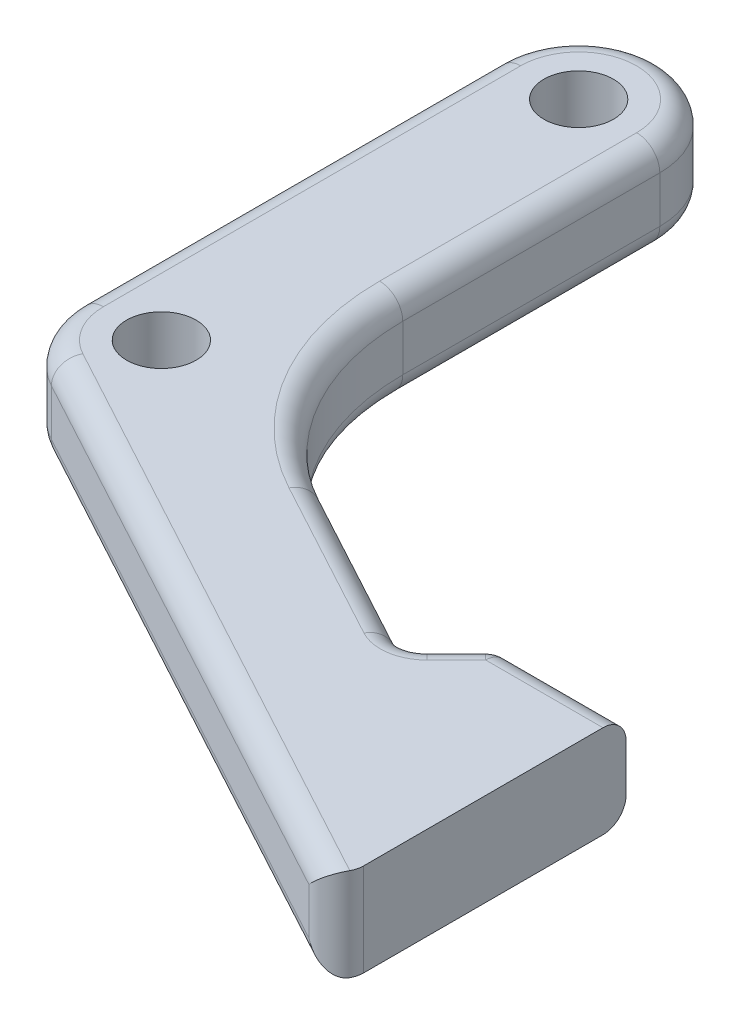
ISO-10303-21;
HEADER;
FILE_DESCRIPTION(('STEP AP214'),'2;1');
FILE_NAME('part.step','',(''),(''),'','','');
FILE_SCHEMA(('AUTOMOTIVE_DESIGN { 1 0 10303 214 1 1 1 1 }'));
ENDSEC;
DATA;
#1=APPLICATION_CONTEXT('core data for automotive mechanical design processes');
#2=APPLICATION_PROTOCOL_DEFINITION('international standard','automotive_design',2000,#1);
#3=PRODUCT_CONTEXT('',#1,'mechanical');
#4=PRODUCT('Part','Part','',(#3));
#5=PRODUCT_RELATED_PRODUCT_CATEGORY('part','',(#4));
#6=PRODUCT_DEFINITION_FORMATION('','',#4);
#7=PRODUCT_DEFINITION_CONTEXT('part definition',#1,'design');
#8=PRODUCT_DEFINITION('design','',#6,#7);
#9=PRODUCT_DEFINITION_SHAPE('','',#8);
#10=(LENGTH_UNIT() NAMED_UNIT(*) SI_UNIT(.MILLI.,.METRE.));
#11=(NAMED_UNIT(*) PLANE_ANGLE_UNIT() SI_UNIT($,.RADIAN.));
#12=(NAMED_UNIT(*) SI_UNIT($,.STERADIAN.) SOLID_ANGLE_UNIT());
#13=UNCERTAINTY_MEASURE_WITH_UNIT(LENGTH_MEASURE(1.E-05),#10,'distance_accuracy_value','');
#14=(GEOMETRIC_REPRESENTATION_CONTEXT(3) GLOBAL_UNCERTAINTY_ASSIGNED_CONTEXT((#13)) GLOBAL_UNIT_ASSIGNED_CONTEXT((#10,
#11,#12)) REPRESENTATION_CONTEXT('',''));
#15=CARTESIAN_POINT('',(0.,0.,0.));
#16=DIRECTION('',(0.,0.,1.));
#17=DIRECTION('',(1.,0.,0.));
#18=AXIS2_PLACEMENT_3D('',#15,#16,#17);
#19=CARTESIAN_POINT('',(0.,4.,-18.));
#20=DIRECTION('',(0.,1.,0.));
#21=DIRECTION('',(0.,0.,1.));
#22=AXIS2_PLACEMENT_3D('',#19,#20,#21);
#23=PLANE('',#22);
#24=CARTESIAN_POINT('',(0.,4.,0.));
#25=DIRECTION('',(0.,1.,0.));
#26=DIRECTION('',(0.,0.,1.));
#27=AXIS2_PLACEMENT_3D('',#24,#25,#26);
#28=CIRCLE('',#27,1.5);
#29=CARTESIAN_POINT('',(0.,4.,1.5));
#30=VERTEX_POINT('',#29);
#31=EDGE_CURVE('E366',#30,#30,#28,.T.);
#32=ORIENTED_EDGE('',*,*,#31,.F.);
#33=EDGE_LOOP('',(#32));
#34=FACE_BOUND('',#33,.T.);
#35=DIRECTION('',(0.,0.,-1.));
#36=VECTOR('',#35,1.);
#37=CARTESIAN_POINT('',(24.,4.,3.95272862152673));
#38=LINE('',#37,#36);
#39=CARTESIAN_POINT('',(24.,4.,15.2753081344414));
#40=VERTEX_POINT('',#39);
#41=CARTESIAN_POINT('',(24.,4.,4.95272862152673));
#42=VERTEX_POINT('',#41);
#43=EDGE_CURVE('E198',#40,#42,#38,.T.);
#44=ORIENTED_EDGE('',*,*,#43,.T.);
#45=DIRECTION('',(-1.,0.,0.));
#46=VECTOR('',#45,1.);
#47=CARTESIAN_POINT('',(18.9430595109026,4.,4.95272862152672));
#48=LINE('',#47,#46);
#49=CARTESIAN_POINT('',(18.9430595109026,4.,4.95272862152673));
#50=VERTEX_POINT('',#49);
#51=EDGE_CURVE('E419',#42,#50,#48,.T.);
#52=ORIENTED_EDGE('',*,*,#51,.T.);
#53=DIRECTION('',(-0.707106781186547,0.,0.707106781186548));
#54=VECTOR('',#53,1.);
#55=CARTESIAN_POINT('',(17.6720356283176,4.,6.22375250411173));
#56=LINE('',#55,#54);
#57=CARTESIAN_POINT('',(17.6720356283176,4.,6.22375250411173));
#58=VERTEX_POINT('',#57);
#59=EDGE_CURVE('E417',#50,#58,#56,.T.);
#60=ORIENTED_EDGE('',*,*,#59,.T.);
#61=CARTESIAN_POINT('',(16.2578220659445,4.,4.80953894173863));
#62=DIRECTION('',(0.,1.,0.));
#63=DIRECTION('',(0.,0.,1.));
#64=AXIS2_PLACEMENT_3D('',#61,#62,#63);
#65=CIRCLE('',#64,2.);
#66=CARTESIAN_POINT('',(15.3066614032854,4.,6.56888353385521));
#67=VERTEX_POINT('',#66);
#68=EDGE_CURVE('E415',#58,#67,#65,.F.);
#69=ORIENTED_EDGE('',*,*,#68,.T.);
#70=DIRECTION('',(-0.879672296058291,0.,-0.47558033132956));
#71=VECTOR('',#70,1.);
#72=CARTESIAN_POINT('',(8.26928303481903,4.,2.76424088321874));
#73=LINE('',#72,#71);
#74=CARTESIAN_POINT('',(8.26928303481903,4.,2.76424088321874));
#75=VERTEX_POINT('',#74);
#76=EDGE_CURVE('E413',#67,#75,#73,.T.);
#77=ORIENTED_EDGE('',*,*,#76,.T.);
#78=CARTESIAN_POINT('',(13.5006666794442,4.,-6.91215437342247));
#79=DIRECTION('',(0.,1.,0.));
#80=DIRECTION('',(0.,0.,1.));
#81=AXIS2_PLACEMENT_3D('',#78,#79,#80);
#82=CIRCLE('',#81,11.);
#83=CARTESIAN_POINT('',(2.50066669932668,4.,-6.91149300008573));
#84=VERTEX_POINT('',#83);
#85=EDGE_CURVE('E411',#75,#84,#82,.F.);
#86=ORIENTED_EDGE('',*,*,#85,.T.);
#87=DIRECTION('',(-6.01248487943532E-05,0.,-0.999999998192501));
#88=VECTOR('',#87,1.);
#89=CARTESIAN_POINT('',(2.49999999548125,4.,-18.000150312122));
#90=LINE('',#89,#88);
#91=CARTESIAN_POINT('',(2.49999999548125,4.,-18.000150312122));
#92=VERTEX_POINT('',#91);
#93=EDGE_CURVE('E409',#84,#92,#90,.T.);
#94=ORIENTED_EDGE('',*,*,#93,.T.);
#95=CARTESIAN_POINT('',(0.,4.,-18.));
#96=DIRECTION('',(0.,1.,0.));
#97=DIRECTION('',(0.,0.,1.));
#98=AXIS2_PLACEMENT_3D('',#95,#96,#97);
#99=CIRCLE('',#98,2.5);
#100=CARTESIAN_POINT('',(-2.49999999548125,4.,-17.999849687878));
#101=VERTEX_POINT('',#100);
#102=EDGE_CURVE('E407',#92,#101,#99,.T.);
#103=ORIENTED_EDGE('',*,*,#102,.T.);
#104=DIRECTION('',(6.01248487946761E-05,0.,0.999999998192501));
#105=VECTOR('',#104,1.);
#106=CARTESIAN_POINT('',(-2.49891776084957,4.,-6.00597783104173E-05));
#107=LINE('',#106,#105);
#108=CARTESIAN_POINT('',(-2.49891775904208,4.,4.6473164202271E-08));
#109=VERTEX_POINT('',#108);
#110=EDGE_CURVE('E405',#101,#109,#107,.T.);
#111=ORIENTED_EDGE('',*,*,#110,.T.);
#112=CARTESIAN_POINT('',(0.,4.,0.));
#113=DIRECTION('',(0.,1.,0.));
#114=DIRECTION('',(0.,0.,1.));
#115=AXIS2_PLACEMENT_3D('',#112,#113,#114);
#116=CIRCLE('',#115,2.49891775904208);
#117=CARTESIAN_POINT('',(-1.18843613581055,4.,2.19822872275738));
#118=VERTEX_POINT('',#117);
#119=EDGE_CURVE('E403',#109,#118,#116,.T.);
#120=ORIENTED_EDGE('',*,*,#119,.T.);
#121=DIRECTION('',(0.879672296058291,0.,0.47558033132956));
#122=VECTOR('',#121,1.);
#123=CARTESIAN_POINT('',(24.4755803313296,4.,16.0730563254684));
#124=LINE('',#123,#122);
#125=CARTESIAN_POINT('',(23.8796722960583,4.,15.750888465771));
#126=VERTEX_POINT('',#125);
#127=EDGE_CURVE('E201',#118,#126,#124,.T.);
#128=ORIENTED_EDGE('',*,*,#127,.T.);
#129=CARTESIAN_POINT('',(23.,4.,15.2753081344414));
#130=DIRECTION('',(0.,1.,0.));
#131=DIRECTION('',(0.,0.,1.));
#132=AXIS2_PLACEMENT_3D('',#129,#130,#131);
#133=CIRCLE('',#132,1.);
#134=EDGE_CURVE('E194',#126,#40,#133,.T.);
#135=ORIENTED_EDGE('',*,*,#134,.T.);
#136=EDGE_LOOP('',(#44,#52,#60,#69,#77,#86,#94,#103,#111,#120,#128,#135));
#137=FACE_BOUND('',#136,.T.);
#138=CARTESIAN_POINT('',(0.,4.,-18.));
#139=DIRECTION('',(0.,1.,0.));
#140=DIRECTION('',(0.,0.,1.));
#141=AXIS2_PLACEMENT_3D('',#138,#139,#140);
#142=CIRCLE('',#141,1.5);
#143=CARTESIAN_POINT('',(0.,4.,-16.5));
#144=VERTEX_POINT('',#143);
#145=EDGE_CURVE('E358',#144,#144,#142,.T.);
#146=ORIENTED_EDGE('',*,*,#145,.F.);
#147=EDGE_LOOP('',(#146));
#148=FACE_BOUND('',#147,.T.);
#149=ADVANCED_FACE('F33',(#34,#137,#148),#23,.T.);
#150=CARTESIAN_POINT('',(0.,0.,-18.));
#151=DIRECTION('',(0.,1.,0.));
#152=DIRECTION('',(0.,0.,1.));
#153=AXIS2_PLACEMENT_3D('',#150,#151,#152);
#154=PLANE('',#153);
#155=DIRECTION('',(-0.707106781186547,0.,0.707106781186548));
#156=VECTOR('',#155,1.);
#157=CARTESIAN_POINT('',(20.9478940662147,0.,2.94789406621464));
#158=LINE('',#157,#156);
#159=CARTESIAN_POINT('',(17.6720356283176,0.,6.22375250411173));
#160=VERTEX_POINT('',#159);
#161=CARTESIAN_POINT('',(18.9430595109026,0.,4.95272862152673));
#162=VERTEX_POINT('',#161);
#163=EDGE_CURVE('E280',#160,#162,#158,.F.);
#164=ORIENTED_EDGE('',*,*,#163,.T.);
#165=DIRECTION('',(-1.,0.,0.));
#166=VECTOR('',#165,1.);
#167=CARTESIAN_POINT('',(0.,0.,4.95272862152671));
#168=LINE('',#167,#166);
#169=CARTESIAN_POINT('',(24.,0.,4.95272862152673));
#170=VERTEX_POINT('',#169);
#171=EDGE_CURVE('E282',#162,#170,#168,.F.);
#172=ORIENTED_EDGE('',*,*,#171,.T.);
#173=DIRECTION('',(0.,0.,-1.));
#174=VECTOR('',#173,1.);
#175=CARTESIAN_POINT('',(24.,0.,3.95272862152673));
#176=LINE('',#175,#174);
#177=CARTESIAN_POINT('',(24.,0.,15.2753081344414));
#178=VERTEX_POINT('',#177);
#179=EDGE_CURVE('E216',#178,#170,#176,.T.);
#180=ORIENTED_EDGE('',*,*,#179,.F.);
#181=CARTESIAN_POINT('',(23.,0.,15.2753081344414));
#182=DIRECTION('',(0.,1.,0.));
#183=DIRECTION('',(0.,0.,1.));
#184=AXIS2_PLACEMENT_3D('',#181,#182,#183);
#185=CIRCLE('',#184,1.);
#186=CARTESIAN_POINT('',(23.8796722960583,0.,15.750888465771));
#187=VERTEX_POINT('',#186);
#188=EDGE_CURVE('E221',#178,#187,#185,.F.);
#189=ORIENTED_EDGE('',*,*,#188,.T.);
#190=DIRECTION('',(0.879672296058291,0.,0.47558033132956));
#191=VECTOR('',#190,1.);
#192=CARTESIAN_POINT('',(-8.71882329218562,0.,-1.87295100509823));
#193=LINE('',#192,#191);
#194=CARTESIAN_POINT('',(-1.18843613581055,0.,2.19822872275738));
#195=VERTEX_POINT('',#194);
#196=EDGE_CURVE('E263',#187,#195,#193,.F.);
#197=ORIENTED_EDGE('',*,*,#196,.T.);
#198=CARTESIAN_POINT('',(0.,0.,0.));
#199=DIRECTION('',(0.,1.,0.));
#200=DIRECTION('',(0.,0.,1.));
#201=AXIS2_PLACEMENT_3D('',#198,#199,#200);
#202=CIRCLE('',#201,2.49891775904208);
#203=CARTESIAN_POINT('',(-2.49891775904208,0.,4.6473164202271E-08));
#204=VERTEX_POINT('',#203);
#205=EDGE_CURVE('E266',#195,#204,#202,.F.);
#206=ORIENTED_EDGE('',*,*,#205,.T.);
#207=DIRECTION('',(6.01248487946761E-05,0.,0.999999998192501));
#208=VECTOR('',#207,1.);
#209=CARTESIAN_POINT('',(-2.49999999548125,0.,-17.999849687878));
#210=LINE('',#209,#208);
#211=CARTESIAN_POINT('',(-2.49999999548125,0.,-17.999849687878));
#212=VERTEX_POINT('',#211);
#213=EDGE_CURVE('E268',#204,#212,#210,.F.);
#214=ORIENTED_EDGE('',*,*,#213,.T.);
#215=CARTESIAN_POINT('',(0.,0.,-18.));
#216=DIRECTION('',(0.,1.,0.));
#217=DIRECTION('',(0.,0.,1.));
#218=AXIS2_PLACEMENT_3D('',#215,#216,#217);
#219=CIRCLE('',#218,2.5);
#220=CARTESIAN_POINT('',(2.49999999548125,0.,-18.000150312122));
#221=VERTEX_POINT('',#220);
#222=EDGE_CURVE('E270',#212,#221,#219,.F.);
#223=ORIENTED_EDGE('',*,*,#222,.T.);
#224=DIRECTION('',(-6.01248487943532E-05,0.,-0.999999998192501));
#225=VECTOR('',#224,1.);
#226=CARTESIAN_POINT('',(2.49999999548125,0.,-18.000150312122));
#227=LINE('',#226,#225);
#228=CARTESIAN_POINT('',(2.50066669932668,0.,-6.91149300008573));
#229=VERTEX_POINT('',#228);
#230=EDGE_CURVE('E272',#221,#229,#227,.F.);
#231=ORIENTED_EDGE('',*,*,#230,.T.);
#232=CARTESIAN_POINT('',(13.5006666794442,0.,-6.91215437342247));
#233=DIRECTION('',(0.,1.,0.));
#234=DIRECTION('',(0.,0.,1.));
#235=AXIS2_PLACEMENT_3D('',#232,#233,#234);
#236=CIRCLE('',#235,11.);
#237=CARTESIAN_POINT('',(8.26928303481903,0.,2.76424088321874));
#238=VERTEX_POINT('',#237);
#239=EDGE_CURVE('E274',#229,#238,#236,.T.);
#240=ORIENTED_EDGE('',*,*,#239,.T.);
#241=DIRECTION('',(-0.879672296058291,0.,-0.47558033132956));
#242=VECTOR('',#241,1.);
#243=CARTESIAN_POINT('',(-6.81650196686738,0.,-5.3916401893314));
#244=LINE('',#243,#242);
#245=CARTESIAN_POINT('',(15.3066614032854,0.,6.56888353385522));
#246=VERTEX_POINT('',#245);
#247=EDGE_CURVE('E276',#238,#246,#244,.F.);
#248=ORIENTED_EDGE('',*,*,#247,.T.);
#249=CARTESIAN_POINT('',(16.2578220659445,0.,4.80953894173863));
#250=DIRECTION('',(0.,1.,0.));
#251=DIRECTION('',(0.,0.,1.));
#252=AXIS2_PLACEMENT_3D('',#249,#250,#251);
#253=CIRCLE('',#252,2.);
#254=EDGE_CURVE('E278',#246,#160,#253,.T.);
#255=ORIENTED_EDGE('',*,*,#254,.T.);
#256=EDGE_LOOP('',(#164,#172,#180,#189,#197,#206,#214,#223,#231,#240,#248,#255));
#257=FACE_BOUND('',#256,.T.);
#258=CARTESIAN_POINT('',(0.,0.,0.));
#259=DIRECTION('',(0.,1.,0.));
#260=DIRECTION('',(0.,0.,1.));
#261=AXIS2_PLACEMENT_3D('',#258,#259,#260);
#262=CIRCLE('',#261,1.5);
#263=CARTESIAN_POINT('',(0.,0.,1.5));
#264=VERTEX_POINT('',#263);
#265=EDGE_CURVE('E363',#264,#264,#262,.T.);
#266=ORIENTED_EDGE('',*,*,#265,.T.);
#267=EDGE_LOOP('',(#266));
#268=FACE_BOUND('',#267,.T.);
#269=CARTESIAN_POINT('',(0.,0.,-18.));
#270=DIRECTION('',(0.,1.,0.));
#271=DIRECTION('',(0.,0.,1.));
#272=AXIS2_PLACEMENT_3D('',#269,#270,#271);
#273=CIRCLE('',#272,1.5);
#274=CARTESIAN_POINT('',(0.,0.,-16.5));
#275=VERTEX_POINT('',#274);
#276=EDGE_CURVE('E353',#275,#275,#273,.T.);
#277=ORIENTED_EDGE('',*,*,#276,.T.);
#278=EDGE_LOOP('',(#277));
#279=FACE_BOUND('',#278,.T.);
#280=ADVANCED_FACE('F459',(#257,#268,#279),#154,.F.);
#281=CARTESIAN_POINT('',(0.,4.,-18.));
#282=DIRECTION('',(0.,-1.,0.));
#283=DIRECTION('',(0.,0.,-1.));
#284=AXIS2_PLACEMENT_3D('',#281,#282,#283);
#285=CYLINDRICAL_SURFACE('',#284,3.5);
#286=DIRECTION('',(0.,-1.,0.));
#287=VECTOR('',#286,1.);
#288=CARTESIAN_POINT('',(-3.49999999367376,4.,-17.9997895630292));
#289=LINE('',#288,#287);
#290=CARTESIAN_POINT('',(-3.49999999367376,3.,-17.9997895630292));
#291=VERTEX_POINT('',#290);
#292=CARTESIAN_POINT('',(-3.49999999367376,1.,-17.9997895630292));
#293=VERTEX_POINT('',#292);
#294=EDGE_CURVE('E205',#291,#293,#289,.T.);
#295=ORIENTED_EDGE('',*,*,#294,.F.);
#296=CARTESIAN_POINT('',(0.,3.,-18.));
#297=DIRECTION('',(0.,1.,0.));
#298=DIRECTION('',(0.,0.,1.));
#299=AXIS2_PLACEMENT_3D('',#296,#297,#298);
#300=CIRCLE('',#299,3.5);
#301=CARTESIAN_POINT('',(3.49999999367376,3.,-18.0002104369708));
#302=VERTEX_POINT('',#301);
#303=EDGE_CURVE('E257',#291,#302,#300,.F.);
#304=ORIENTED_EDGE('',*,*,#303,.T.);
#305=DIRECTION('',(0.,-1.,0.));
#306=VECTOR('',#305,1.);
#307=CARTESIAN_POINT('',(3.49999999367376,4.,-18.0002104369708));
#308=LINE('',#307,#306);
#309=CARTESIAN_POINT('',(3.49999999367376,1.,-18.0002104369708));
#310=VERTEX_POINT('',#309);
#311=EDGE_CURVE('E215',#302,#310,#308,.T.);
#312=ORIENTED_EDGE('',*,*,#311,.T.);
#313=CARTESIAN_POINT('',(0.,1.,-18.));
#314=DIRECTION('',(0.,1.,0.));
#315=DIRECTION('',(0.,0.,1.));
#316=AXIS2_PLACEMENT_3D('',#313,#314,#315);
#317=CIRCLE('',#316,3.5);
#318=EDGE_CURVE('E255',#310,#293,#317,.T.);
#319=ORIENTED_EDGE('',*,*,#318,.T.);
#320=EDGE_LOOP('',(#295,#304,#312,#319));
#321=FACE_BOUND('',#320,.T.);
#322=ADVANCED_FACE('F551',(#321),#285,.T.);
#323=CARTESIAN_POINT('',(-3.49999999367376,4.,-17.9997895630292));
#324=DIRECTION('',(0.999999998192501,0.,-6.01248487946761E-05));
#325=DIRECTION('',(-6.01248487946761E-05,0.,-0.999999998192501));
#326=AXIS2_PLACEMENT_3D('',#323,#324,#325);
#327=PLANE('',#326);
#328=DIRECTION('',(0.,-1.,0.));
#329=VECTOR('',#328,1.);
#330=CARTESIAN_POINT('',(-3.49891775904207,4.,6.50704805941821E-08));
#331=LINE('',#330,#329);
#332=CARTESIAN_POINT('',(-3.49891775904207,3.,6.50704805941821E-08));
#333=VERTEX_POINT('',#332);
#334=CARTESIAN_POINT('',(-3.49891775904207,1.,6.50704805941821E-08));
#335=VERTEX_POINT('',#334);
#336=EDGE_CURVE('E397',#333,#335,#331,.T.);
#337=ORIENTED_EDGE('',*,*,#336,.F.);
#338=DIRECTION('',(6.01248487946761E-05,0.,0.999999998192501));
#339=VECTOR('',#338,1.);
#340=CARTESIAN_POINT('',(-3.49999999367376,3.,-17.9997895630292));
#341=LINE('',#340,#339);
#342=EDGE_CURVE('E286',#333,#291,#341,.F.);
#343=ORIENTED_EDGE('',*,*,#342,.T.);
#344=ORIENTED_EDGE('',*,*,#294,.T.);
#345=DIRECTION('',(6.01248487946761E-05,0.,0.999999998192501));
#346=VECTOR('',#345,1.);
#347=CARTESIAN_POINT('',(-3.49999999367376,1.,-17.9997895630292));
#348=LINE('',#347,#346);
#349=EDGE_CURVE('E284',#293,#335,#348,.T.);
#350=ORIENTED_EDGE('',*,*,#349,.T.);
#351=EDGE_LOOP('',(#337,#343,#344,#350));
#352=FACE_BOUND('',#351,.T.);
#353=ADVANCED_FACE('F582',(#352),#327,.F.);
#354=CARTESIAN_POINT('',(0.,4.,0.));
#355=DIRECTION('',(0.,-1.,0.));
#356=DIRECTION('',(0.,0.,-1.));
#357=AXIS2_PLACEMENT_3D('',#354,#355,#356);
#358=CYLINDRICAL_SURFACE('',#357,3.49891775904208);
#359=DIRECTION('',(0.,-1.,0.));
#360=VECTOR('',#359,1.);
#361=CARTESIAN_POINT('',(-1.66401646714011,4.,3.07790101881567));
#362=LINE('',#361,#360);
#363=CARTESIAN_POINT('',(-1.66401646714011,3.,3.07790101881567));
#364=VERTEX_POINT('',#363);
#365=CARTESIAN_POINT('',(-1.66401646714011,1.,3.07790101881567));
#366=VERTEX_POINT('',#365);
#367=EDGE_CURVE('E395',#364,#366,#362,.T.);
#368=ORIENTED_EDGE('',*,*,#367,.F.);
#369=CARTESIAN_POINT('',(0.,3.,0.));
#370=DIRECTION('',(0.,1.,0.));
#371=DIRECTION('',(0.,0.,1.));
#372=AXIS2_PLACEMENT_3D('',#369,#370,#371);
#373=CIRCLE('',#372,3.49891775904208);
#374=EDGE_CURVE('E261',#364,#333,#373,.F.);
#375=ORIENTED_EDGE('',*,*,#374,.T.);
#376=ORIENTED_EDGE('',*,*,#336,.T.);
#377=CARTESIAN_POINT('',(0.,1.,0.));
#378=DIRECTION('',(0.,1.,0.));
#379=DIRECTION('',(0.,0.,1.));
#380=AXIS2_PLACEMENT_3D('',#377,#378,#379);
#381=CIRCLE('',#380,3.49891775904208);
#382=EDGE_CURVE('E259',#335,#366,#381,.T.);
#383=ORIENTED_EDGE('',*,*,#382,.T.);
#384=EDGE_LOOP('',(#368,#375,#376,#383));
#385=FACE_BOUND('',#384,.T.);
#386=ADVANCED_FACE('F579',(#385),#358,.T.);
#387=CARTESIAN_POINT('',(-1.66401646714011,4.,3.07790101881567));
#388=DIRECTION('',(0.47558033132956,0.,-0.879672296058291));
#389=DIRECTION('',(-0.879672296058291,0.,-0.47558033132956));
#390=AXIS2_PLACEMENT_3D('',#387,#388,#389);
#391=PLANE('',#390);
#392=DIRECTION('',(0.,-1.,0.));
#393=VECTOR('',#392,1.);
#394=CARTESIAN_POINT('',(22.5244196686704,4.,16.1549804304997));
#395=LINE('',#394,#393);
#396=CARTESIAN_POINT('',(22.5244196686704,1.,16.1549804304997));
#397=VERTEX_POINT('',#396);
#398=CARTESIAN_POINT('',(22.5244196686704,3.,16.1549804304997));
#399=VERTEX_POINT('',#398);
#400=EDGE_CURVE('E42',#397,#399,#395,.F.);
#401=ORIENTED_EDGE('',*,*,#400,.T.);
#402=DIRECTION('',(0.879672296058291,0.,0.47558033132956));
#403=VECTOR('',#402,1.);
#404=CARTESIAN_POINT('',(-1.66401646714011,3.,3.07790101881568));
#405=LINE('',#404,#403);
#406=EDGE_CURVE('E11',#399,#364,#405,.F.);
#407=ORIENTED_EDGE('',*,*,#406,.T.);
#408=ORIENTED_EDGE('',*,*,#367,.T.);
#409=DIRECTION('',(0.879672296058291,0.,0.47558033132956));
#410=VECTOR('',#409,1.);
#411=CARTESIAN_POINT('',(-1.66401646714011,1.,3.07790101881567));
#412=LINE('',#411,#410);
#413=EDGE_CURVE('E53',#366,#397,#412,.T.);
#414=ORIENTED_EDGE('',*,*,#413,.T.);
#415=EDGE_LOOP('',(#401,#407,#408,#414));
#416=FACE_BOUND('',#415,.T.);
#417=ADVANCED_FACE('F576',(#416),#391,.F.);
#418=CARTESIAN_POINT('',(24.,4.,3.95272862152673));
#419=DIRECTION('',(-1.,0.,0.));
#420=DIRECTION('',(0.,0.,1.));
#421=AXIS2_PLACEMENT_3D('',#418,#419,#420);
#422=PLANE('',#421);
#423=DIRECTION('',(0.,-1.,0.));
#424=VECTOR('',#423,1.);
#425=CARTESIAN_POINT('',(24.,4.,3.95272862152673));
#426=LINE('',#425,#424);
#427=CARTESIAN_POINT('',(24.,3.,3.95272862152673));
#428=VERTEX_POINT('',#427);
#429=CARTESIAN_POINT('',(24.,1.,3.95272862152673));
#430=VERTEX_POINT('',#429);
#431=EDGE_CURVE('E392',#428,#430,#426,.T.);
#432=ORIENTED_EDGE('',*,*,#431,.F.);
#433=CARTESIAN_POINT('',(24.,3.,4.95272862152673));
#434=DIRECTION('',(-1.,0.,0.));
#435=DIRECTION('',(0.,0.,1.));
#436=AXIS2_PLACEMENT_3D('',#433,#434,#435);
#437=CIRCLE('',#436,1.);
#438=EDGE_CURVE('E214',#428,#42,#437,.F.);
#439=ORIENTED_EDGE('',*,*,#438,.T.);
#440=ORIENTED_EDGE('',*,*,#43,.F.);
#441=DIRECTION('',(0.,-1.,0.));
#442=VECTOR('',#441,1.);
#443=CARTESIAN_POINT('',(24.,4.,15.2753081344414));
#444=LINE('',#443,#442);
#445=EDGE_CURVE('E211',#40,#178,#444,.T.);
#446=ORIENTED_EDGE('',*,*,#445,.T.);
#447=ORIENTED_EDGE('',*,*,#179,.T.);
#448=CARTESIAN_POINT('',(24.,1.,4.95272862152673));
#449=DIRECTION('',(-1.,0.,0.));
#450=DIRECTION('',(0.,0.,1.));
#451=AXIS2_PLACEMENT_3D('',#448,#449,#450);
#452=CIRCLE('',#451,1.);
#453=EDGE_CURVE('E222',#170,#430,#452,.F.);
#454=ORIENTED_EDGE('',*,*,#453,.T.);
#455=EDGE_LOOP('',(#432,#439,#440,#446,#447,#454));
#456=FACE_BOUND('',#455,.T.);
#457=ADVANCED_FACE('F209',(#456),#422,.F.);
#458=CARTESIAN_POINT('',(24.,4.,3.95272862152673));
#459=DIRECTION('',(0.,0.,1.));
#460=DIRECTION('',(1.,0.,0.));
#461=AXIS2_PLACEMENT_3D('',#458,#459,#460);
#462=PLANE('',#461);
#463=DIRECTION('',(0.,-1.,0.));
#464=VECTOR('',#463,1.);
#465=CARTESIAN_POINT('',(18.9430595109026,4.,3.95272862152673));
#466=LINE('',#465,#464);
#467=CARTESIAN_POINT('',(18.9430595109026,3.,3.95272862152673));
#468=VERTEX_POINT('',#467);
#469=CARTESIAN_POINT('',(18.9430595109026,1.,3.95272862152673));
#470=VERTEX_POINT('',#469);
#471=EDGE_CURVE('E389',#468,#470,#466,.T.);
#472=ORIENTED_EDGE('',*,*,#471,.F.);
#473=DIRECTION('',(-1.,0.,0.));
#474=VECTOR('',#473,1.);
#475=CARTESIAN_POINT('',(24.,3.,3.95272862152673));
#476=LINE('',#475,#474);
#477=EDGE_CURVE('E223',#468,#428,#476,.F.);
#478=ORIENTED_EDGE('',*,*,#477,.T.);
#479=ORIENTED_EDGE('',*,*,#431,.T.);
#480=DIRECTION('',(-1.,0.,0.));
#481=VECTOR('',#480,1.);
#482=CARTESIAN_POINT('',(24.,1.,3.95272862152673));
#483=LINE('',#482,#481);
#484=EDGE_CURVE('E226',#430,#470,#483,.T.);
#485=ORIENTED_EDGE('',*,*,#484,.T.);
#486=EDGE_LOOP('',(#472,#478,#479,#485));
#487=FACE_BOUND('',#486,.T.);
#488=ADVANCED_FACE('F423',(#487),#462,.F.);
#489=CARTESIAN_POINT('',(18.9430595109026,4.,4.95272862152673));
#490=DIRECTION('',(0.,-1.,0.));
#491=DIRECTION('',(0.,0.,-1.));
#492=AXIS2_PLACEMENT_3D('',#489,#490,#491);
#493=CYLINDRICAL_SURFACE('',#492,1.);
#494=DIRECTION('',(0.,-1.,0.));
#495=VECTOR('',#494,1.);
#496=CARTESIAN_POINT('',(18.235952729716,4.,4.24562184034018));
#497=LINE('',#496,#495);
#498=CARTESIAN_POINT('',(18.235952729716,3.,4.24562184034018));
#499=VERTEX_POINT('',#498);
#500=CARTESIAN_POINT('',(18.235952729716,1.,4.24562184034018));
#501=VERTEX_POINT('',#500);
#502=EDGE_CURVE('E386',#499,#501,#497,.T.);
#503=ORIENTED_EDGE('',*,*,#502,.F.);
#504=CARTESIAN_POINT('',(18.9430595109026,3.,4.95272862152673));
#505=DIRECTION('',(0.,-1.,0.));
#506=DIRECTION('',(0.,0.,-1.));
#507=AXIS2_PLACEMENT_3D('',#504,#505,#506);
#508=CIRCLE('',#507,1.);
#509=EDGE_CURVE('E233',#499,#468,#508,.T.);
#510=ORIENTED_EDGE('',*,*,#509,.T.);
#511=ORIENTED_EDGE('',*,*,#471,.T.);
#512=CARTESIAN_POINT('',(18.9430595109026,1.,4.95272862152673));
#513=DIRECTION('',(0.,-1.,0.));
#514=DIRECTION('',(0.,0.,-1.));
#515=AXIS2_PLACEMENT_3D('',#512,#513,#514);
#516=CIRCLE('',#515,1.);
#517=EDGE_CURVE('E231',#470,#501,#516,.F.);
#518=ORIENTED_EDGE('',*,*,#517,.T.);
#519=EDGE_LOOP('',(#503,#510,#511,#518));
#520=FACE_BOUND('',#519,.T.);
#521=ADVANCED_FACE('F429',(#520),#493,.T.);
#522=CARTESIAN_POINT('',(18.235952729716,4.,4.24562184034018));
#523=DIRECTION('',(0.707106781186548,0.,0.707106781186547));
#524=DIRECTION('',(0.707106781186547,0.,-0.707106781186548));
#525=AXIS2_PLACEMENT_3D('',#522,#523,#524);
#526=PLANE('',#525);
#527=DIRECTION('',(0.,-1.,0.));
#528=VECTOR('',#527,1.);
#529=CARTESIAN_POINT('',(16.964928847131,4.,5.51664572292518));
#530=LINE('',#529,#528);
#531=CARTESIAN_POINT('',(16.964928847131,3.,5.51664572292518));
#532=VERTEX_POINT('',#531);
#533=CARTESIAN_POINT('',(16.964928847131,1.,5.51664572292518));
#534=VERTEX_POINT('',#533);
#535=EDGE_CURVE('E383',#532,#534,#530,.T.);
#536=ORIENTED_EDGE('',*,*,#535,.F.);
#537=DIRECTION('',(-0.707106781186547,0.,0.707106781186548));
#538=VECTOR('',#537,1.);
#539=CARTESIAN_POINT('',(18.235952729716,3.,4.24562184034018));
#540=LINE('',#539,#538);
#541=EDGE_CURVE('E237',#532,#499,#540,.F.);
#542=ORIENTED_EDGE('',*,*,#541,.T.);
#543=ORIENTED_EDGE('',*,*,#502,.T.);
#544=DIRECTION('',(-0.707106781186547,0.,0.707106781186548));
#545=VECTOR('',#544,1.);
#546=CARTESIAN_POINT('',(18.235952729716,1.,4.24562184034018));
#547=LINE('',#546,#545);
#548=EDGE_CURVE('E235',#501,#534,#547,.T.);
#549=ORIENTED_EDGE('',*,*,#548,.T.);
#550=EDGE_LOOP('',(#536,#542,#543,#549));
#551=FACE_BOUND('',#550,.T.);
#552=ADVANCED_FACE('F438',(#551),#526,.F.);
#553=CARTESIAN_POINT('',(16.2578220659445,4.,4.80953894173863));
#554=DIRECTION('',(0.,-1.,0.));
#555=DIRECTION('',(0.,0.,-1.));
#556=AXIS2_PLACEMENT_3D('',#553,#554,#555);
#557=CYLINDRICAL_SURFACE('',#556,1.);
#558=DIRECTION('',(0.,-1.,0.));
#559=VECTOR('',#558,1.);
#560=CARTESIAN_POINT('',(15.7822417346149,4.,5.68921123779692));
#561=LINE('',#560,#559);
#562=CARTESIAN_POINT('',(15.7822417346149,3.,5.68921123779692));
#563=VERTEX_POINT('',#562);
#564=CARTESIAN_POINT('',(15.7822417346149,1.,5.68921123779692));
#565=VERTEX_POINT('',#564);
#566=EDGE_CURVE('E380',#563,#565,#561,.T.);
#567=ORIENTED_EDGE('',*,*,#566,.F.);
#568=CARTESIAN_POINT('',(16.2578220659445,3.,4.80953894173863));
#569=DIRECTION('',(0.,1.,0.));
#570=DIRECTION('',(0.,0.,1.));
#571=AXIS2_PLACEMENT_3D('',#568,#569,#570);
#572=CIRCLE('',#571,1.);
#573=EDGE_CURVE('E241',#563,#532,#572,.T.);
#574=ORIENTED_EDGE('',*,*,#573,.T.);
#575=ORIENTED_EDGE('',*,*,#535,.T.);
#576=CARTESIAN_POINT('',(16.2578220659445,1.,4.80953894173863));
#577=DIRECTION('',(0.,1.,0.));
#578=DIRECTION('',(0.,0.,1.));
#579=AXIS2_PLACEMENT_3D('',#576,#577,#578);
#580=CIRCLE('',#579,1.);
#581=EDGE_CURVE('E239',#534,#565,#580,.F.);
#582=ORIENTED_EDGE('',*,*,#581,.T.);
#583=EDGE_LOOP('',(#567,#574,#575,#582));
#584=FACE_BOUND('',#583,.T.);
#585=ADVANCED_FACE('F442',(#584),#557,.F.);
#586=CARTESIAN_POINT('',(15.7822417346149,4.,5.68921123779692));
#587=DIRECTION('',(-0.47558033132956,0.,0.879672296058291));
#588=DIRECTION('',(0.879672296058291,0.,0.47558033132956));
#589=AXIS2_PLACEMENT_3D('',#586,#587,#588);
#590=PLANE('',#589);
#591=DIRECTION('',(0.,-1.,0.));
#592=VECTOR('',#591,1.);
#593=CARTESIAN_POINT('',(8.74486336614859,4.,1.88456858716045));
#594=LINE('',#593,#592);
#595=CARTESIAN_POINT('',(8.74486336614859,3.,1.88456858716045));
#596=VERTEX_POINT('',#595);
#597=CARTESIAN_POINT('',(8.74486336614859,1.,1.88456858716045));
#598=VERTEX_POINT('',#597);
#599=EDGE_CURVE('E377',#596,#598,#594,.T.);
#600=ORIENTED_EDGE('',*,*,#599,.F.);
#601=DIRECTION('',(-0.879672296058291,0.,-0.47558033132956));
#602=VECTOR('',#601,1.);
#603=CARTESIAN_POINT('',(15.7822417346149,3.,5.68921123779692));
#604=LINE('',#603,#602);
#605=EDGE_CURVE('E245',#596,#563,#604,.F.);
#606=ORIENTED_EDGE('',*,*,#605,.T.);
#607=ORIENTED_EDGE('',*,*,#566,.T.);
#608=DIRECTION('',(-0.879672296058291,0.,-0.47558033132956));
#609=VECTOR('',#608,1.);
#610=CARTESIAN_POINT('',(15.7822417346149,1.,5.68921123779692));
#611=LINE('',#610,#609);
#612=EDGE_CURVE('E243',#565,#598,#611,.T.);
#613=ORIENTED_EDGE('',*,*,#612,.T.);
#614=EDGE_LOOP('',(#600,#606,#607,#613));
#615=FACE_BOUND('',#614,.T.);
#616=ADVANCED_FACE('F474',(#615),#590,.F.);
#617=CARTESIAN_POINT('',(13.5006666794442,4.,-6.91215437342247));
#618=DIRECTION('',(0.,-1.,0.));
#619=DIRECTION('',(0.,0.,-1.));
#620=AXIS2_PLACEMENT_3D('',#617,#618,#619);
#621=CYLINDRICAL_SURFACE('',#620,10.);
#622=DIRECTION('',(0.,-1.,0.));
#623=VECTOR('',#622,1.);
#624=CARTESIAN_POINT('',(3.50066669751918,4.,-6.91155312493452));
#625=LINE('',#624,#623);
#626=CARTESIAN_POINT('',(3.50066669751918,3.,-6.91155312493452));
#627=VERTEX_POINT('',#626);
#628=CARTESIAN_POINT('',(3.50066669751918,1.,-6.91155312493452));
#629=VERTEX_POINT('',#628);
#630=EDGE_CURVE('E374',#627,#629,#625,.T.);
#631=ORIENTED_EDGE('',*,*,#630,.F.);
#632=CARTESIAN_POINT('',(13.5006666794442,3.,-6.91215437342247));
#633=DIRECTION('',(0.,1.,0.));
#634=DIRECTION('',(0.,0.,1.));
#635=AXIS2_PLACEMENT_3D('',#632,#633,#634);
#636=CIRCLE('',#635,10.);
#637=EDGE_CURVE('E249',#627,#596,#636,.T.);
#638=ORIENTED_EDGE('',*,*,#637,.T.);
#639=ORIENTED_EDGE('',*,*,#599,.T.);
#640=CARTESIAN_POINT('',(13.5006666794442,1.,-6.91215437342247));
#641=DIRECTION('',(0.,1.,0.));
#642=DIRECTION('',(0.,0.,1.));
#643=AXIS2_PLACEMENT_3D('',#640,#641,#642);
#644=CIRCLE('',#643,10.);
#645=EDGE_CURVE('E247',#598,#629,#644,.F.);
#646=ORIENTED_EDGE('',*,*,#645,.T.);
#647=EDGE_LOOP('',(#631,#638,#639,#646));
#648=FACE_BOUND('',#647,.T.);
#649=ADVANCED_FACE('F478',(#648),#621,.F.);
#650=CARTESIAN_POINT('',(3.49999999367376,4.,-18.0002104369708));
#651=DIRECTION('',(-0.999999998192501,0.,6.01248487943532E-05));
#652=DIRECTION('',(6.01248487943532E-05,0.,0.999999998192501));
#653=AXIS2_PLACEMENT_3D('',#650,#651,#652);
#654=PLANE('',#653);
#655=ORIENTED_EDGE('',*,*,#311,.F.);
#656=DIRECTION('',(-6.01248487943532E-05,0.,-0.999999998192501));
#657=VECTOR('',#656,1.);
#658=CARTESIAN_POINT('',(3.50066669751918,3.,-6.91155312493452));
#659=LINE('',#658,#657);
#660=EDGE_CURVE('E253',#302,#627,#659,.F.);
#661=ORIENTED_EDGE('',*,*,#660,.T.);
#662=ORIENTED_EDGE('',*,*,#630,.T.);
#663=DIRECTION('',(-6.01248487943532E-05,0.,-0.999999998192501));
#664=VECTOR('',#663,1.);
#665=CARTESIAN_POINT('',(3.49999999367376,1.,-18.0002104369708));
#666=LINE('',#665,#664);
#667=EDGE_CURVE('E251',#629,#310,#666,.T.);
#668=ORIENTED_EDGE('',*,*,#667,.T.);
#669=EDGE_LOOP('',(#655,#661,#662,#668));
#670=FACE_BOUND('',#669,.T.);
#671=ADVANCED_FACE('F558',(#670),#654,.F.);
#672=CARTESIAN_POINT('',(0.,4.,0.));
#673=DIRECTION('',(0.,-1.,0.));
#674=DIRECTION('',(0.,0.,-1.));
#675=AXIS2_PLACEMENT_3D('',#672,#673,#674);
#676=CYLINDRICAL_SURFACE('',#675,1.5);
#677=ORIENTED_EDGE('',*,*,#31,.T.);
#678=EDGE_LOOP('',(#677));
#679=FACE_BOUND('',#678,.T.);
#680=ORIENTED_EDGE('',*,*,#265,.F.);
#681=EDGE_LOOP('',(#680));
#682=FACE_BOUND('',#681,.T.);
#683=ADVANCED_FACE('F555',(#679,#682),#676,.F.);
#684=CARTESIAN_POINT('',(0.,4.,-18.));
#685=DIRECTION('',(0.,-1.,0.));
#686=DIRECTION('',(0.,0.,-1.));
#687=AXIS2_PLACEMENT_3D('',#684,#685,#686);
#688=CYLINDRICAL_SURFACE('',#687,1.5);
#689=ORIENTED_EDGE('',*,*,#145,.T.);
#690=EDGE_LOOP('',(#689));
#691=FACE_BOUND('',#690,.T.);
#692=ORIENTED_EDGE('',*,*,#276,.F.);
#693=EDGE_LOOP('',(#692));
#694=FACE_BOUND('',#693,.T.);
#695=ADVANCED_FACE('F758',(#691,#694),#688,.F.);
#696=CARTESIAN_POINT('',(24.,1.,4.95272862152673));
#697=DIRECTION('',(-1.,0.,0.));
#698=DIRECTION('',(0.,0.,1.));
#699=AXIS2_PLACEMENT_3D('',#696,#697,#698);
#700=CYLINDRICAL_SURFACE('',#699,1.);
#701=CARTESIAN_POINT('',(18.9430595109026,1.,4.95272862152673));
#702=DIRECTION('',(-1.,0.,0.));
#703=DIRECTION('',(0.,0.,1.));
#704=AXIS2_PLACEMENT_3D('',#701,#702,#703);
#705=CIRCLE('',#704,1.);
#706=EDGE_CURVE('E37',#470,#162,#705,.T.);
#707=ORIENTED_EDGE('',*,*,#706,.F.);
#708=ORIENTED_EDGE('',*,*,#484,.F.);
#709=ORIENTED_EDGE('',*,*,#453,.F.);
#710=ORIENTED_EDGE('',*,*,#171,.F.);
#711=EDGE_LOOP('',(#707,#708,#709,#710));
#712=FACE_BOUND('',#711,.T.);
#713=ADVANCED_FACE('F35',(#712),#700,.T.);
#714=CARTESIAN_POINT('',(18.9430595109026,1.,4.95272862152673));
#715=DIRECTION('',(0.,1.,0.));
#716=DIRECTION('',(0.,0.,1.));
#717=AXIS2_PLACEMENT_3D('',#714,#715,#716);
#718=SPHERICAL_SURFACE('',#717,1.);
#719=ORIENTED_EDGE('',*,*,#517,.F.);
#720=ORIENTED_EDGE('',*,*,#706,.T.);
#721=CARTESIAN_POINT('',(18.9430595109026,1.,4.95272862152673));
#722=DIRECTION('',(-0.707106781186547,0.,0.707106781186548));
#723=DIRECTION('',(0.707106781186548,0.,0.707106781186547));
#724=AXIS2_PLACEMENT_3D('',#721,#722,#723);
#725=CIRCLE('',#724,1.);
#726=EDGE_CURVE('E346',#501,#162,#725,.T.);
#727=ORIENTED_EDGE('',*,*,#726,.F.);
#728=EDGE_LOOP('',(#719,#720,#727));
#729=FACE_BOUND('',#728,.T.);
#730=ADVANCED_FACE('F432',(#729),#718,.T.);
#731=CARTESIAN_POINT('',(18.9430595109026,1.,4.95272862152673));
#732=DIRECTION('',(-0.707106781186547,0.,0.707106781186548));
#733=DIRECTION('',(0.707106781186548,0.,0.707106781186547));
#734=AXIS2_PLACEMENT_3D('',#731,#732,#733);
#735=CYLINDRICAL_SURFACE('',#734,1.);
#736=ORIENTED_EDGE('',*,*,#726,.T.);
#737=ORIENTED_EDGE('',*,*,#163,.F.);
#738=CARTESIAN_POINT('',(17.6720356283176,1.,6.22375250411173));
#739=DIRECTION('',(-0.707106781186547,0.,0.707106781186548));
#740=DIRECTION('',(0.707106781186548,0.,0.707106781186547));
#741=AXIS2_PLACEMENT_3D('',#738,#739,#740);
#742=CIRCLE('',#741,1.);
#743=EDGE_CURVE('E344',#534,#160,#742,.T.);
#744=ORIENTED_EDGE('',*,*,#743,.F.);
#745=ORIENTED_EDGE('',*,*,#548,.F.);
#746=EDGE_LOOP('',(#736,#737,#744,#745));
#747=FACE_BOUND('',#746,.T.);
#748=ADVANCED_FACE('F434',(#747),#735,.T.);
#749=CARTESIAN_POINT('',(16.2578220659445,1.,4.80953894173863));
#750=DIRECTION('',(0.,1.,0.));
#751=DIRECTION('',(0.,0.,1.));
#752=AXIS2_PLACEMENT_3D('',#749,#750,#751);
#753=TOROIDAL_SURFACE('',#752,2.,1.);
#754=ORIENTED_EDGE('',*,*,#743,.T.);
#755=ORIENTED_EDGE('',*,*,#254,.F.);
#756=CARTESIAN_POINT('',(15.3066614032854,1.,6.56888353385522));
#757=DIRECTION('',(-0.879672296058291,0.,-0.475580331329561));
#758=DIRECTION('',(-0.475580331329561,0.,0.879672296058291));
#759=AXIS2_PLACEMENT_3D('',#756,#757,#758);
#760=CIRCLE('',#759,1.);
#761=EDGE_CURVE('E341',#565,#246,#760,.T.);
#762=ORIENTED_EDGE('',*,*,#761,.F.);
#763=ORIENTED_EDGE('',*,*,#581,.F.);
#764=EDGE_LOOP('',(#754,#755,#762,#763));
#765=FACE_BOUND('',#764,.T.);
#766=ADVANCED_FACE('F464',(#765),#753,.T.);
#767=CARTESIAN_POINT('',(15.3066614032854,1.,6.56888353385522));
#768=DIRECTION('',(-0.879672296058291,0.,-0.47558033132956));
#769=DIRECTION('',(-0.47558033132956,0.,0.879672296058291));
#770=AXIS2_PLACEMENT_3D('',#767,#768,#769);
#771=CYLINDRICAL_SURFACE('',#770,1.);
#772=ORIENTED_EDGE('',*,*,#761,.T.);
#773=ORIENTED_EDGE('',*,*,#247,.F.);
#774=CARTESIAN_POINT('',(8.26928303481903,1.,2.76424088321874));
#775=DIRECTION('',(-0.879672296058291,0.,-0.475580331329561));
#776=DIRECTION('',(-0.475580331329561,0.,0.879672296058291));
#777=AXIS2_PLACEMENT_3D('',#774,#775,#776);
#778=CIRCLE('',#777,1.);
#779=EDGE_CURVE('E338',#598,#238,#778,.T.);
#780=ORIENTED_EDGE('',*,*,#779,.F.);
#781=ORIENTED_EDGE('',*,*,#612,.F.);
#782=EDGE_LOOP('',(#772,#773,#780,#781));
#783=FACE_BOUND('',#782,.T.);
#784=ADVANCED_FACE('F470',(#783),#771,.T.);
#785=CARTESIAN_POINT('',(13.5006666794442,1.,-6.91215437342247));
#786=DIRECTION('',(0.,1.,0.));
#787=DIRECTION('',(0.,0.,1.));
#788=AXIS2_PLACEMENT_3D('',#785,#786,#787);
#789=TOROIDAL_SURFACE('',#788,11.,1.);
#790=ORIENTED_EDGE('',*,*,#779,.T.);
#791=ORIENTED_EDGE('',*,*,#239,.F.);
#792=CARTESIAN_POINT('',(2.50066669932668,1.,-6.91149300008573));
#793=DIRECTION('',(-6.01248487950082E-05,0.,-0.999999998192501));
#794=DIRECTION('',(-0.999999998192501,0.,6.01248487950082E-05));
#795=AXIS2_PLACEMENT_3D('',#792,#793,#794);
#796=CIRCLE('',#795,1.);
#797=EDGE_CURVE('E335',#629,#229,#796,.T.);
#798=ORIENTED_EDGE('',*,*,#797,.F.);
#799=ORIENTED_EDGE('',*,*,#645,.F.);
#800=EDGE_LOOP('',(#790,#791,#798,#799));
#801=FACE_BOUND('',#800,.T.);
#802=ADVANCED_FACE('F536',(#801),#789,.T.);
#803=CARTESIAN_POINT('',(2.49999999548125,1.,-18.000150312122));
#804=DIRECTION('',(-6.01248487943532E-05,0.,-0.999999998192501));
#805=DIRECTION('',(-0.999999998192501,0.,6.01248487943532E-05));
#806=AXIS2_PLACEMENT_3D('',#803,#804,#805);
#807=CYLINDRICAL_SURFACE('',#806,1.);
#808=ORIENTED_EDGE('',*,*,#797,.T.);
#809=ORIENTED_EDGE('',*,*,#230,.F.);
#810=CARTESIAN_POINT('',(2.49999999548125,1.,-18.000150312122));
#811=DIRECTION('',(-6.01248487941408E-05,0.,-0.999999998192501));
#812=DIRECTION('',(-0.999999998192501,0.,6.01248487941408E-05));
#813=AXIS2_PLACEMENT_3D('',#810,#811,#812);
#814=CIRCLE('',#813,1.);
#815=EDGE_CURVE('E332',#310,#221,#814,.T.);
#816=ORIENTED_EDGE('',*,*,#815,.F.);
#817=ORIENTED_EDGE('',*,*,#667,.F.);
#818=EDGE_LOOP('',(#808,#809,#816,#817));
#819=FACE_BOUND('',#818,.T.);
#820=ADVANCED_FACE('F532',(#819),#807,.T.);
#821=CARTESIAN_POINT('',(0.,1.,-18.));
#822=DIRECTION('',(0.,1.,0.));
#823=DIRECTION('',(0.,0.,1.));
#824=AXIS2_PLACEMENT_3D('',#821,#822,#823);
#825=TOROIDAL_SURFACE('',#824,2.5,1.);
#826=ORIENTED_EDGE('',*,*,#815,.T.);
#827=ORIENTED_EDGE('',*,*,#222,.F.);
#828=CARTESIAN_POINT('',(-2.49999999548125,1.,-17.999849687878));
#829=DIRECTION('',(6.01248487941408E-05,0.,0.999999998192501));
#830=DIRECTION('',(0.999999998192501,0.,-6.01248487941408E-05));
#831=AXIS2_PLACEMENT_3D('',#828,#829,#830);
#832=CIRCLE('',#831,1.);
#833=EDGE_CURVE('E329',#293,#212,#832,.T.);
#834=ORIENTED_EDGE('',*,*,#833,.F.);
#835=ORIENTED_EDGE('',*,*,#318,.F.);
#836=EDGE_LOOP('',(#826,#827,#834,#835));
#837=FACE_BOUND('',#836,.T.);
#838=ADVANCED_FACE('F527',(#837),#825,.T.);
#839=CARTESIAN_POINT('',(-2.49999999548125,1.,-17.999849687878));
#840=DIRECTION('',(6.01248487946761E-05,0.,0.999999998192501));
#841=DIRECTION('',(0.999999998192501,0.,-6.01248487946761E-05));
#842=AXIS2_PLACEMENT_3D('',#839,#840,#841);
#843=CYLINDRICAL_SURFACE('',#842,1.);
#844=ORIENTED_EDGE('',*,*,#833,.T.);
#845=ORIENTED_EDGE('',*,*,#213,.F.);
#846=CARTESIAN_POINT('',(-2.49891776084957,1.,-6.0059778314082E-05));
#847=DIRECTION('',(6.01248486860677E-05,6.0106251369743E-05,0.999999996386121));
#848=DIRECTION('',(0.999999998192501,0.,-6.01248487946761E-05));
#849=AXIS2_PLACEMENT_3D('',#846,#847,#848);
#850=CIRCLE('',#849,1.);
#851=EDGE_CURVE('E326',#335,#204,#850,.T.);
#852=ORIENTED_EDGE('',*,*,#851,.F.);
#853=ORIENTED_EDGE('',*,*,#349,.F.);
#854=EDGE_LOOP('',(#844,#845,#852,#853));
#855=FACE_BOUND('',#854,.T.);
#856=ADVANCED_FACE('F522',(#855),#843,.T.);
#857=CARTESIAN_POINT('',(0.,1.,0.));
#858=DIRECTION('',(0.,1.,0.));
#859=DIRECTION('',(0.,0.,1.));
#860=AXIS2_PLACEMENT_3D('',#857,#858,#859);
#861=TOROIDAL_SURFACE('',#860,2.49891775904208,1.);
#862=ORIENTED_EDGE('',*,*,#851,.T.);
#863=ORIENTED_EDGE('',*,*,#205,.F.);
#864=CARTESIAN_POINT('',(-1.18843613581055,1.,2.19822872275738));
#865=DIRECTION('',(0.879672296058291,0.,0.47558033132956));
#866=DIRECTION('',(0.47558033132956,0.,-0.879672296058291));
#867=AXIS2_PLACEMENT_3D('',#864,#865,#866);
#868=CIRCLE('',#867,1.);
#869=EDGE_CURVE('E323',#366,#195,#868,.T.);
#870=ORIENTED_EDGE('',*,*,#869,.F.);
#871=ORIENTED_EDGE('',*,*,#382,.F.);
#872=EDGE_LOOP('',(#862,#863,#870,#871));
#873=FACE_BOUND('',#872,.T.);
#874=ADVANCED_FACE('F517',(#873),#861,.T.);
#875=CARTESIAN_POINT('',(-1.18843613581055,1.,2.19822872275738));
#876=DIRECTION('',(0.879672296058291,0.,0.47558033132956));
#877=DIRECTION('',(0.47558033132956,0.,-0.879672296058291));
#878=AXIS2_PLACEMENT_3D('',#875,#876,#877);
#879=CYLINDRICAL_SURFACE('',#878,1.);
#880=ORIENTED_EDGE('',*,*,#869,.T.);
#881=ORIENTED_EDGE('',*,*,#196,.F.);
#882=CARTESIAN_POINT('',(23.,1.,15.2753081344414));
#883=DIRECTION('',(0.622022245764758,0.707106781186547,0.336286077282077));
#884=DIRECTION('',(0.622022245764758,-0.707106781186547,0.336286077282077));
#885=AXIS2_PLACEMENT_3D('',#882,#883,#884);
#886=ELLIPSE('',#885,1.41421356237309,1.);
#887=EDGE_CURVE('E321',#397,#187,#886,.T.);
#888=ORIENTED_EDGE('',*,*,#887,.F.);
#889=ORIENTED_EDGE('',*,*,#413,.F.);
#890=EDGE_LOOP('',(#880,#881,#888,#889));
#891=FACE_BOUND('',#890,.T.);
#892=ADVANCED_FACE('F512',(#891),#879,.T.);
#893=CARTESIAN_POINT('',(23.,4.,15.2753081344414));
#894=DIRECTION('',(0.,-1.,0.));
#895=DIRECTION('',(0.,0.,-1.));
#896=AXIS2_PLACEMENT_3D('',#893,#894,#895);
#897=CYLINDRICAL_SURFACE('',#896,1.);
#898=ORIENTED_EDGE('',*,*,#445,.F.);
#899=ORIENTED_EDGE('',*,*,#134,.F.);
#900=CARTESIAN_POINT('',(23.,3.,15.2753081344414));
#901=DIRECTION('',(0.622022245764758,-0.707106781186547,0.336286077282077));
#902=DIRECTION('',(-0.622022245764758,-0.707106781186547,-0.336286077282077));
#903=AXIS2_PLACEMENT_3D('',#900,#901,#902);
#904=ELLIPSE('',#903,1.41421356237309,1.);
#905=EDGE_CURVE('E319',#399,#126,#904,.F.);
#906=ORIENTED_EDGE('',*,*,#905,.F.);
#907=ORIENTED_EDGE('',*,*,#400,.F.);
#908=ORIENTED_EDGE('',*,*,#887,.T.);
#909=ORIENTED_EDGE('',*,*,#188,.F.);
#910=EDGE_LOOP('',(#898,#899,#906,#907,#908,#909));
#911=FACE_BOUND('',#910,.T.);
#912=ADVANCED_FACE('F219',(#911),#897,.T.);
#913=CARTESIAN_POINT('',(-8.71882329218562,3.,-1.87295100509824));
#914=DIRECTION('',(-0.879672296058291,0.,-0.47558033132956));
#915=DIRECTION('',(-0.47558033132956,0.,0.879672296058291));
#916=AXIS2_PLACEMENT_3D('',#913,#914,#915);
#917=CYLINDRICAL_SURFACE('',#916,1.);
#918=ORIENTED_EDGE('',*,*,#905,.T.);
#919=ORIENTED_EDGE('',*,*,#127,.F.);
#920=CARTESIAN_POINT('',(-1.18843613581055,3.,2.19822872275738));
#921=DIRECTION('',(-0.879672296058291,0.,-0.47558033132956));
#922=DIRECTION('',(-0.47558033132956,0.,0.879672296058291));
#923=AXIS2_PLACEMENT_3D('',#920,#921,#922);
#924=CIRCLE('',#923,1.);
#925=EDGE_CURVE('E316',#364,#118,#924,.T.);
#926=ORIENTED_EDGE('',*,*,#925,.F.);
#927=ORIENTED_EDGE('',*,*,#406,.F.);
#928=EDGE_LOOP('',(#918,#919,#926,#927));
#929=FACE_BOUND('',#928,.T.);
#930=ADVANCED_FACE('F509',(#929),#917,.T.);
#931=CARTESIAN_POINT('',(0.,3.,0.));
#932=DIRECTION('',(0.,1.,0.));
#933=DIRECTION('',(0.,0.,1.));
#934=AXIS2_PLACEMENT_3D('',#931,#932,#933);
#935=TOROIDAL_SURFACE('',#934,2.49891775904208,1.);
#936=ORIENTED_EDGE('',*,*,#925,.T.);
#937=ORIENTED_EDGE('',*,*,#119,.F.);
#938=CARTESIAN_POINT('',(-2.49891775904208,3.,4.6473164202271E-08));
#939=DIRECTION('',(-1.85973163919111E-08,0.,-1.));
#940=DIRECTION('',(-1.,0.,1.85973163919111E-08));
#941=AXIS2_PLACEMENT_3D('',#938,#939,#940);
#942=CIRCLE('',#941,1.);
#943=EDGE_CURVE('E313',#333,#109,#942,.T.);
#944=ORIENTED_EDGE('',*,*,#943,.F.);
#945=ORIENTED_EDGE('',*,*,#374,.F.);
#946=EDGE_LOOP('',(#936,#937,#944,#945));
#947=FACE_BOUND('',#946,.T.);
#948=ADVANCED_FACE('F506',(#947),#935,.T.);
#949=CARTESIAN_POINT('',(-2.49999999548125,3.,-17.999849687878));
#950=DIRECTION('',(-6.01248487946761E-05,0.,-0.999999998192501));
#951=DIRECTION('',(-0.999999998192501,0.,6.01248487946761E-05));
#952=AXIS2_PLACEMENT_3D('',#949,#950,#951);
#953=CYLINDRICAL_SURFACE('',#952,1.);
#954=ORIENTED_EDGE('',*,*,#943,.T.);
#955=ORIENTED_EDGE('',*,*,#110,.F.);
#956=CARTESIAN_POINT('',(-2.49999999548125,3.,-17.999849687878));
#957=DIRECTION('',(-6.01248487941408E-05,0.,-0.999999998192501));
#958=DIRECTION('',(-0.999999998192501,0.,6.01248487941408E-05));
#959=AXIS2_PLACEMENT_3D('',#956,#957,#958);
#960=CIRCLE('',#959,1.);
#961=EDGE_CURVE('E310',#291,#101,#960,.T.);
#962=ORIENTED_EDGE('',*,*,#961,.F.);
#963=ORIENTED_EDGE('',*,*,#342,.F.);
#964=EDGE_LOOP('',(#954,#955,#962,#963));
#965=FACE_BOUND('',#964,.T.);
#966=ADVANCED_FACE('F501',(#965),#953,.T.);
#967=CARTESIAN_POINT('',(0.,3.,-18.));
#968=DIRECTION('',(0.,1.,0.));
#969=DIRECTION('',(0.,0.,1.));
#970=AXIS2_PLACEMENT_3D('',#967,#968,#969);
#971=TOROIDAL_SURFACE('',#970,2.5,1.);
#972=ORIENTED_EDGE('',*,*,#961,.T.);
#973=ORIENTED_EDGE('',*,*,#102,.F.);
#974=CARTESIAN_POINT('',(2.49999999548125,3.,-18.000150312122));
#975=DIRECTION('',(6.01248487941408E-05,0.,0.999999998192501));
#976=DIRECTION('',(0.999999998192501,0.,-6.01248487941408E-05));
#977=AXIS2_PLACEMENT_3D('',#974,#975,#976);
#978=CIRCLE('',#977,1.);
#979=EDGE_CURVE('E307',#302,#92,#978,.T.);
#980=ORIENTED_EDGE('',*,*,#979,.F.);
#981=ORIENTED_EDGE('',*,*,#303,.F.);
#982=EDGE_LOOP('',(#972,#973,#980,#981));
#983=FACE_BOUND('',#982,.T.);
#984=ADVANCED_FACE('F496',(#983),#971,.T.);
#985=CARTESIAN_POINT('',(2.49999999548125,3.,-18.000150312122));
#986=DIRECTION('',(6.01248487943532E-05,0.,0.999999998192501));
#987=DIRECTION('',(0.999999998192501,0.,-6.01248487943532E-05));
#988=AXIS2_PLACEMENT_3D('',#985,#986,#987);
#989=CYLINDRICAL_SURFACE('',#988,1.);
#990=ORIENTED_EDGE('',*,*,#979,.T.);
#991=ORIENTED_EDGE('',*,*,#93,.F.);
#992=CARTESIAN_POINT('',(2.50066669932668,3.,-6.91149300008573));
#993=DIRECTION('',(6.01248487941408E-05,0.,0.999999998192501));
#994=DIRECTION('',(0.999999998192501,0.,-6.01248487941408E-05));
#995=AXIS2_PLACEMENT_3D('',#992,#993,#994);
#996=CIRCLE('',#995,1.);
#997=EDGE_CURVE('E304',#627,#84,#996,.T.);
#998=ORIENTED_EDGE('',*,*,#997,.F.);
#999=ORIENTED_EDGE('',*,*,#660,.F.);
#1000=EDGE_LOOP('',(#990,#991,#998,#999));
#1001=FACE_BOUND('',#1000,.T.);
#1002=ADVANCED_FACE('F491',(#1001),#989,.T.);
#1003=CARTESIAN_POINT('',(13.5006666794442,3.,-6.91215437342247));
#1004=DIRECTION('',(0.,1.,0.));
#1005=DIRECTION('',(0.,0.,1.));
#1006=AXIS2_PLACEMENT_3D('',#1003,#1004,#1005);
#1007=TOROIDAL_SURFACE('',#1006,11.,1.);
#1008=ORIENTED_EDGE('',*,*,#997,.T.);
#1009=ORIENTED_EDGE('',*,*,#85,.F.);
#1010=CARTESIAN_POINT('',(8.26928303481903,3.,2.76424088321874));
#1011=DIRECTION('',(0.879672296058291,0.,0.475580331329561));
#1012=DIRECTION('',(0.475580331329561,0.,-0.879672296058291));
#1013=AXIS2_PLACEMENT_3D('',#1010,#1011,#1012);
#1014=CIRCLE('',#1013,1.);
#1015=EDGE_CURVE('E301',#596,#75,#1014,.T.);
#1016=ORIENTED_EDGE('',*,*,#1015,.F.);
#1017=ORIENTED_EDGE('',*,*,#637,.F.);
#1018=EDGE_LOOP('',(#1008,#1009,#1016,#1017));
#1019=FACE_BOUND('',#1018,.T.);
#1020=ADVANCED_FACE('F482',(#1019),#1007,.T.);
#1021=CARTESIAN_POINT('',(-6.81650196686738,3.,-5.3916401893314));
#1022=DIRECTION('',(0.879672296058291,0.,0.47558033132956));
#1023=DIRECTION('',(0.47558033132956,0.,-0.879672296058291));
#1024=AXIS2_PLACEMENT_3D('',#1021,#1022,#1023);
#1025=CYLINDRICAL_SURFACE('',#1024,1.);
#1026=ORIENTED_EDGE('',*,*,#1015,.T.);
#1027=ORIENTED_EDGE('',*,*,#76,.F.);
#1028=CARTESIAN_POINT('',(15.3066614032854,3.,6.56888353385522));
#1029=DIRECTION('',(0.879672296058291,0.,0.475580331329561));
#1030=DIRECTION('',(0.475580331329561,0.,-0.879672296058291));
#1031=AXIS2_PLACEMENT_3D('',#1028,#1029,#1030);
#1032=CIRCLE('',#1031,1.);
#1033=EDGE_CURVE('E298',#563,#67,#1032,.T.);
#1034=ORIENTED_EDGE('',*,*,#1033,.F.);
#1035=ORIENTED_EDGE('',*,*,#605,.F.);
#1036=EDGE_LOOP('',(#1026,#1027,#1034,#1035));
#1037=FACE_BOUND('',#1036,.T.);
#1038=ADVANCED_FACE('F487',(#1037),#1025,.T.);
#1039=CARTESIAN_POINT('',(16.2578220659445,3.,4.80953894173863));
#1040=DIRECTION('',(0.,1.,0.));
#1041=DIRECTION('',(0.,0.,1.));
#1042=AXIS2_PLACEMENT_3D('',#1039,#1040,#1041);
#1043=TOROIDAL_SURFACE('',#1042,2.,1.);
#1044=ORIENTED_EDGE('',*,*,#1033,.T.);
#1045=ORIENTED_EDGE('',*,*,#68,.F.);
#1046=CARTESIAN_POINT('',(17.6720356283176,3.,6.22375250411173));
#1047=DIRECTION('',(0.707106781186547,0.,-0.707106781186548));
#1048=DIRECTION('',(-0.707106781186548,0.,-0.707106781186547));
#1049=AXIS2_PLACEMENT_3D('',#1046,#1047,#1048);
#1050=CIRCLE('',#1049,1.);
#1051=EDGE_CURVE('E295',#532,#58,#1050,.T.);
#1052=ORIENTED_EDGE('',*,*,#1051,.F.);
#1053=ORIENTED_EDGE('',*,*,#573,.F.);
#1054=EDGE_LOOP('',(#1044,#1045,#1052,#1053));
#1055=FACE_BOUND('',#1054,.T.);
#1056=ADVANCED_FACE('F446',(#1055),#1043,.T.);
#1057=CARTESIAN_POINT('',(20.9478940662147,3.,2.94789406621464));
#1058=DIRECTION('',(0.707106781186547,0.,-0.707106781186548));
#1059=DIRECTION('',(-0.707106781186548,0.,-0.707106781186547));
#1060=AXIS2_PLACEMENT_3D('',#1057,#1058,#1059);
#1061=CYLINDRICAL_SURFACE('',#1060,1.);
#1062=CARTESIAN_POINT('',(18.9430595109026,3.,4.95272862152673));
#1063=DIRECTION('',(0.707106781186547,0.,-0.707106781186548));
#1064=DIRECTION('',(-0.707106781186548,0.,-0.707106781186547));
#1065=AXIS2_PLACEMENT_3D('',#1062,#1063,#1064);
#1066=CIRCLE('',#1065,1.);
#1067=EDGE_CURVE('E292',#499,#50,#1066,.T.);
#1068=ORIENTED_EDGE('',*,*,#1067,.F.);
#1069=ORIENTED_EDGE('',*,*,#541,.F.);
#1070=ORIENTED_EDGE('',*,*,#1051,.T.);
#1071=ORIENTED_EDGE('',*,*,#59,.F.);
#1072=EDGE_LOOP('',(#1068,#1069,#1070,#1071));
#1073=FACE_BOUND('',#1072,.T.);
#1074=ADVANCED_FACE('F452',(#1073),#1061,.T.);
#1075=CARTESIAN_POINT('',(18.9430595109026,3.,4.95272862152673));
#1076=DIRECTION('',(0.,1.,0.));
#1077=DIRECTION('',(0.,0.,1.));
#1078=AXIS2_PLACEMENT_3D('',#1075,#1076,#1077);
#1079=SPHERICAL_SURFACE('',#1078,1.);
#1080=ORIENTED_EDGE('',*,*,#509,.F.);
#1081=ORIENTED_EDGE('',*,*,#1067,.T.);
#1082=CARTESIAN_POINT('',(18.9430595109026,3.,4.95272862152673));
#1083=DIRECTION('',(1.,0.,0.));
#1084=DIRECTION('',(0.,0.,-1.));
#1085=AXIS2_PLACEMENT_3D('',#1082,#1083,#1084);
#1086=CIRCLE('',#1085,1.);
#1087=EDGE_CURVE('E290',#468,#50,#1086,.T.);
#1088=ORIENTED_EDGE('',*,*,#1087,.F.);
#1089=EDGE_LOOP('',(#1080,#1081,#1088));
#1090=FACE_BOUND('',#1089,.T.);
#1091=ADVANCED_FACE('F455',(#1090),#1079,.T.);
#1092=CARTESIAN_POINT('',(0.,3.,4.95272862152671));
#1093=DIRECTION('',(1.,0.,0.));
#1094=DIRECTION('',(0.,0.,-1.));
#1095=AXIS2_PLACEMENT_3D('',#1092,#1093,#1094);
#1096=CYLINDRICAL_SURFACE('',#1095,1.);
#1097=ORIENTED_EDGE('',*,*,#438,.F.);
#1098=ORIENTED_EDGE('',*,*,#477,.F.);
#1099=ORIENTED_EDGE('',*,*,#1087,.T.);
#1100=ORIENTED_EDGE('',*,*,#51,.F.);
#1101=EDGE_LOOP('',(#1097,#1098,#1099,#1100));
#1102=FACE_BOUND('',#1101,.T.);
#1103=ADVANCED_FACE('F457',(#1102),#1096,.T.);
#1104=CLOSED_SHELL('',(#149,#280,#322,#353,#386,#417,#457,#488,#521,#552,#585,#616,#649,#671,
#683,#695,#713,#730,#748,#766,#784,#802,#820,#838,#856,#874,#892,#912,#930,#948,#966,#984,#1002,
#1020,#1038,#1056,#1074,#1091,#1103));
#1105=MANIFOLD_SOLID_BREP('B2',#1104);
#1106=ADVANCED_BREP_SHAPE_REPRESENTATION('',(#18,#1105),#14);
#1107=SHAPE_DEFINITION_REPRESENTATION(#9,#1106);
ENDSEC;
END-ISO-10303-21;
